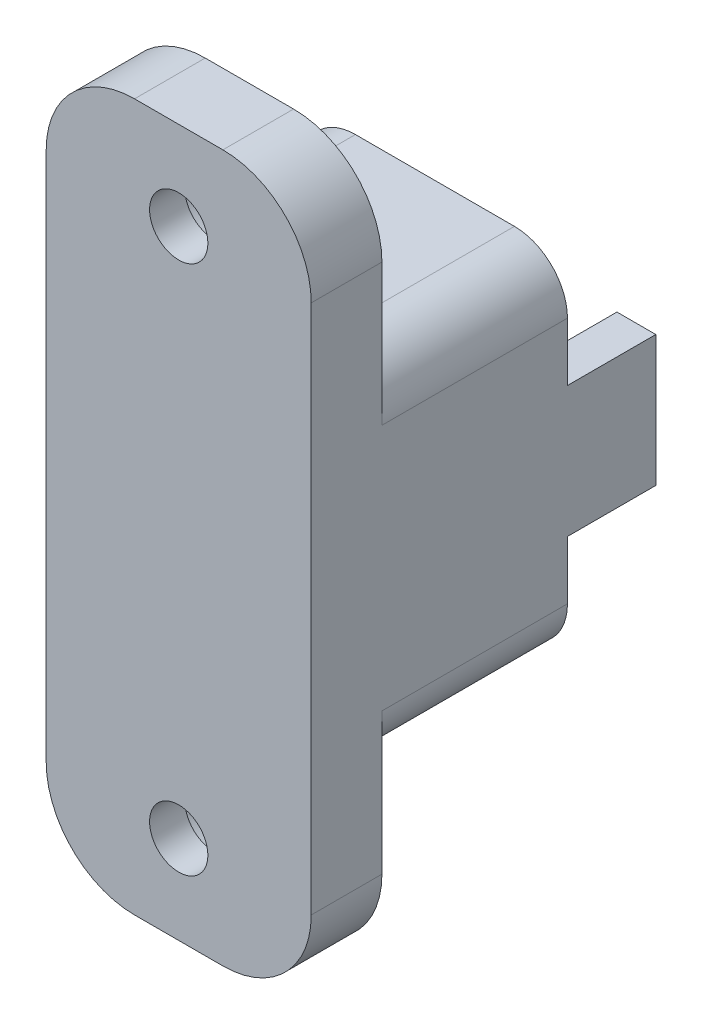
ISO-10303-21;
HEADER;
FILE_DESCRIPTION(('STEP AP214'),'2;1');
FILE_NAME('part.step','',(''),(''),'','','');
FILE_SCHEMA(('AUTOMOTIVE_DESIGN { 1 0 10303 214 1 1 1 1 }'));
ENDSEC;
DATA;
#1=APPLICATION_CONTEXT('core data for automotive mechanical design processes');
#2=APPLICATION_PROTOCOL_DEFINITION('international standard','automotive_design',2000,#1);
#3=PRODUCT_CONTEXT('',#1,'mechanical');
#4=PRODUCT('Part','Part','',(#3));
#5=PRODUCT_RELATED_PRODUCT_CATEGORY('part','',(#4));
#6=PRODUCT_DEFINITION_FORMATION('','',#4);
#7=PRODUCT_DEFINITION_CONTEXT('part definition',#1,'design');
#8=PRODUCT_DEFINITION('design','',#6,#7);
#9=PRODUCT_DEFINITION_SHAPE('','',#8);
#10=(LENGTH_UNIT() NAMED_UNIT(*) SI_UNIT(.MILLI.,.METRE.));
#11=(NAMED_UNIT(*) PLANE_ANGLE_UNIT() SI_UNIT($,.RADIAN.));
#12=(NAMED_UNIT(*) SI_UNIT($,.STERADIAN.) SOLID_ANGLE_UNIT());
#13=UNCERTAINTY_MEASURE_WITH_UNIT(LENGTH_MEASURE(1.E-05),#10,'distance_accuracy_value','');
#14=(GEOMETRIC_REPRESENTATION_CONTEXT(3) GLOBAL_UNCERTAINTY_ASSIGNED_CONTEXT((#13)) GLOBAL_UNIT_ASSIGNED_CONTEXT((#10,
#11,#12)) REPRESENTATION_CONTEXT('',''));
#15=CARTESIAN_POINT('',(0.,0.,0.));
#16=DIRECTION('',(0.,0.,1.));
#17=DIRECTION('',(1.,0.,0.));
#18=AXIS2_PLACEMENT_3D('',#15,#16,#17);
#19=CARTESIAN_POINT('',(-7.5,-1.50786714585182,55.5));
#20=DIRECTION('',(-1.,0.,0.));
#21=DIRECTION('',(0.,0.,1.));
#22=AXIS2_PLACEMENT_3D('',#19,#20,#21);
#23=PLANE('',#22);
#24=DIRECTION('',(0.,-1.,0.));
#25=VECTOR('',#24,1.);
#26=CARTESIAN_POINT('',(-7.5,-1.50786714585182,59.5));
#27=LINE('',#26,#25);
#28=CARTESIAN_POINT('',(-7.5,15.,59.5));
#29=VERTEX_POINT('',#28);
#30=CARTESIAN_POINT('',(-7.5,-15.,59.5));
#31=VERTEX_POINT('',#30);
#32=EDGE_CURVE('E443',#29,#31,#27,.T.);
#33=ORIENTED_EDGE('',*,*,#32,.F.);
#34=DIRECTION('',(0.,0.,1.));
#35=VECTOR('',#34,1.);
#36=CARTESIAN_POINT('',(-7.5,15.,55.5));
#37=LINE('',#36,#35);
#38=CARTESIAN_POINT('',(-7.5,15.,55.5));
#39=VERTEX_POINT('',#38);
#40=EDGE_CURVE('E570',#29,#39,#37,.F.);
#41=ORIENTED_EDGE('',*,*,#40,.T.);
#42=DIRECTION('',(0.,-1.,0.));
#43=VECTOR('',#42,1.);
#44=CARTESIAN_POINT('',(-7.5,-1.50786714585182,55.5));
#45=LINE('',#44,#43);
#46=CARTESIAN_POINT('',(-7.5,7.,55.5));
#47=VERTEX_POINT('',#46);
#48=EDGE_CURVE('E453',#39,#47,#45,.T.);
#49=ORIENTED_EDGE('',*,*,#48,.T.);
#50=DIRECTION('',(0.,0.,1.));
#51=VECTOR('',#50,1.);
#52=CARTESIAN_POINT('',(-7.5,7.,45.));
#53=LINE('',#52,#51);
#54=CARTESIAN_POINT('',(-7.5,7.,45.));
#55=VERTEX_POINT('',#54);
#56=EDGE_CURVE('E493',#47,#55,#53,.F.);
#57=ORIENTED_EDGE('',*,*,#56,.T.);
#58=DIRECTION('',(0.,-1.,0.));
#59=VECTOR('',#58,1.);
#60=CARTESIAN_POINT('',(-7.5,-1.50786714585182,45.));
#61=LINE('',#60,#59);
#62=CARTESIAN_POINT('',(-7.5,3.7,45.));
#63=VERTEX_POINT('',#62);
#64=EDGE_CURVE('E413',#55,#63,#61,.T.);
#65=ORIENTED_EDGE('',*,*,#64,.T.);
#66=DIRECTION('',(0.,0.,1.));
#67=VECTOR('',#66,1.);
#68=CARTESIAN_POINT('',(-7.5,3.7,40.));
#69=LINE('',#68,#67);
#70=CARTESIAN_POINT('',(-7.5,3.7,40.));
#71=VERTEX_POINT('',#70);
#72=EDGE_CURVE('E402',#71,#63,#69,.T.);
#73=ORIENTED_EDGE('',*,*,#72,.F.);
#74=DIRECTION('',(0.,-1.,0.));
#75=VECTOR('',#74,1.);
#76=CARTESIAN_POINT('',(-7.5,-1.50786714585182,40.));
#77=LINE('',#76,#75);
#78=CARTESIAN_POINT('',(-7.5,-3.7,40.));
#79=VERTEX_POINT('',#78);
#80=EDGE_CURVE('E366',#71,#79,#77,.T.);
#81=ORIENTED_EDGE('',*,*,#80,.T.);
#82=DIRECTION('',(0.,0.,1.));
#83=VECTOR('',#82,1.);
#84=CARTESIAN_POINT('',(-7.5,-3.7,40.));
#85=LINE('',#84,#83);
#86=CARTESIAN_POINT('',(-7.5,-3.7,45.));
#87=VERTEX_POINT('',#86);
#88=EDGE_CURVE('E382',#79,#87,#85,.T.);
#89=ORIENTED_EDGE('',*,*,#88,.T.);
#90=CARTESIAN_POINT('',(-7.5,-7.,45.));
#91=VERTEX_POINT('',#90);
#92=EDGE_CURVE('E411',#87,#91,#61,.T.);
#93=ORIENTED_EDGE('',*,*,#92,.T.);
#94=DIRECTION('',(0.,0.,1.));
#95=VECTOR('',#94,1.);
#96=CARTESIAN_POINT('',(-7.5,-7.,55.5));
#97=LINE('',#96,#95);
#98=CARTESIAN_POINT('',(-7.5,-7.,55.5));
#99=VERTEX_POINT('',#98);
#100=EDGE_CURVE('E496',#91,#99,#97,.T.);
#101=ORIENTED_EDGE('',*,*,#100,.T.);
#102=CARTESIAN_POINT('',(-7.5,-15.,55.5));
#103=VERTEX_POINT('',#102);
#104=EDGE_CURVE('E451',#99,#103,#45,.T.);
#105=ORIENTED_EDGE('',*,*,#104,.T.);
#106=DIRECTION('',(0.,0.,1.));
#107=VECTOR('',#106,1.);
#108=CARTESIAN_POINT('',(-7.5,-15.,55.5));
#109=LINE('',#108,#107);
#110=EDGE_CURVE('E566',#103,#31,#109,.T.);
#111=ORIENTED_EDGE('',*,*,#110,.T.);
#112=EDGE_LOOP('',(#33,#41,#49,#57,#65,#73,#81,#89,#93,#101,#105,#111));
#113=FACE_BOUND('',#112,.T.);
#114=DIRECTION('',(0.,0.,-1.));
#115=VECTOR('',#114,1.);
#116=CARTESIAN_POINT('',(-7.5,-2.9,48.3596902340651));
#117=LINE('',#116,#115);
#118=CARTESIAN_POINT('',(-7.5,-2.9,50.));
#119=VERTEX_POINT('',#118);
#120=CARTESIAN_POINT('',(-7.5,-2.9,47.));
#121=VERTEX_POINT('',#120);
#122=EDGE_CURVE('E308',#119,#121,#117,.T.);
#123=ORIENTED_EDGE('',*,*,#122,.T.);
#124=DIRECTION('',(0.,1.,0.));
#125=VECTOR('',#124,1.);
#126=CARTESIAN_POINT('',(-7.5,0.0214725732803344,47.));
#127=LINE('',#126,#125);
#128=CARTESIAN_POINT('',(-7.5,2.9,47.));
#129=VERTEX_POINT('',#128);
#130=EDGE_CURVE('E271',#121,#129,#127,.T.);
#131=ORIENTED_EDGE('',*,*,#130,.T.);
#132=DIRECTION('',(0.,0.,-1.));
#133=VECTOR('',#132,1.);
#134=CARTESIAN_POINT('',(-7.5,2.9,48.1294283518046));
#135=LINE('',#134,#133);
#136=CARTESIAN_POINT('',(-7.5,2.9,50.));
#137=VERTEX_POINT('',#136);
#138=EDGE_CURVE('E293',#137,#129,#135,.T.);
#139=ORIENTED_EDGE('',*,*,#138,.F.);
#140=DIRECTION('',(0.,1.,0.));
#141=VECTOR('',#140,1.);
#142=CARTESIAN_POINT('',(-7.5,0.0214725732803349,50.));
#143=LINE('',#142,#141);
#144=EDGE_CURVE('E39',#119,#137,#143,.T.);
#145=ORIENTED_EDGE('',*,*,#144,.F.);
#146=EDGE_LOOP('',(#123,#131,#139,#145));
#147=FACE_BOUND('',#146,.T.);
#148=ADVANCED_FACE('F16',(#113,#147),#23,.T.);
#149=CARTESIAN_POINT('',(0.,0.,55.));
#150=DIRECTION('',(0.,0.,-1.));
#151=DIRECTION('',(-1.,0.,0.));
#152=AXIS2_PLACEMENT_3D('',#149,#150,#151);
#153=CYLINDRICAL_SURFACE('',#152,1.65);
#154=CARTESIAN_POINT('',(0.,0.,45.));
#155=DIRECTION('',(0.,0.,-1.));
#156=DIRECTION('',(1.,0.,0.));
#157=AXIS2_PLACEMENT_3D('',#154,#155,#156);
#158=CIRCLE('',#157,1.65);
#159=CARTESIAN_POINT('',(1.65000000000001,0.,45.));
#160=VERTEX_POINT('',#159);
#161=EDGE_CURVE('E324',#160,#160,#158,.T.);
#162=ORIENTED_EDGE('',*,*,#161,.T.);
#163=EDGE_LOOP('',(#162));
#164=FACE_BOUND('',#163,.T.);
#165=CARTESIAN_POINT('',(0.,0.,47.));
#166=DIRECTION('',(0.,0.,1.));
#167=DIRECTION('',(0.,-1.,0.));
#168=AXIS2_PLACEMENT_3D('',#165,#166,#167);
#169=CIRCLE('',#168,1.65);
#170=CARTESIAN_POINT('',(0.,-1.64999999999998,47.));
#171=VERTEX_POINT('',#170);
#172=EDGE_CURVE('E20',#171,#171,#169,.F.);
#173=ORIENTED_EDGE('',*,*,#172,.F.);
#174=EDGE_LOOP('',(#173));
#175=FACE_BOUND('',#174,.T.);
#176=ADVANCED_FACE('F606',(#164,#175),#153,.F.);
#177=CARTESIAN_POINT('',(0.,0.,45.));
#178=DIRECTION('',(0.,0.,-1.));
#179=DIRECTION('',(1.,0.,0.));
#180=AXIS2_PLACEMENT_3D('',#177,#178,#179);
#181=PLANE('',#180);
#182=ORIENTED_EDGE('',*,*,#161,.F.);
#183=EDGE_LOOP('',(#182));
#184=FACE_BOUND('',#183,.T.);
#185=DIRECTION('',(1.,0.,0.));
#186=VECTOR('',#185,1.);
#187=CARTESIAN_POINT('',(0.,-10.,45.));
#188=LINE('',#187,#186);
#189=CARTESIAN_POINT('',(-4.5,-10.,45.));
#190=VERTEX_POINT('',#189);
#191=CARTESIAN_POINT('',(4.5,-10.,45.));
#192=VERTEX_POINT('',#191);
#193=EDGE_CURVE('E407',#190,#192,#188,.T.);
#194=ORIENTED_EDGE('',*,*,#193,.F.);
#195=CARTESIAN_POINT('',(-4.5,-7.,45.));
#196=DIRECTION('',(0.,0.,-1.));
#197=DIRECTION('',(-1.,0.,0.));
#198=AXIS2_PLACEMENT_3D('',#195,#196,#197);
#199=CIRCLE('',#198,3.);
#200=EDGE_CURVE('E516',#190,#91,#199,.T.);
#201=ORIENTED_EDGE('',*,*,#200,.T.);
#202=ORIENTED_EDGE('',*,*,#92,.F.);
#203=DIRECTION('',(1.,0.,0.));
#204=VECTOR('',#203,1.);
#205=CARTESIAN_POINT('',(-6.46282042376698,-3.7,45.));
#206=LINE('',#205,#204);
#207=CARTESIAN_POINT('',(-5.3,-3.7,45.));
#208=VERTEX_POINT('',#207);
#209=EDGE_CURVE('E371',#87,#208,#206,.T.);
#210=ORIENTED_EDGE('',*,*,#209,.T.);
#211=DIRECTION('',(0.,1.,0.));
#212=VECTOR('',#211,1.);
#213=CARTESIAN_POINT('',(-5.3,0.262452171929203,45.));
#214=LINE('',#213,#212);
#215=CARTESIAN_POINT('',(-5.3,3.7,45.));
#216=VERTEX_POINT('',#215);
#217=EDGE_CURVE('E386',#208,#216,#214,.T.);
#218=ORIENTED_EDGE('',*,*,#217,.T.);
#219=DIRECTION('',(1.,0.,0.));
#220=VECTOR('',#219,1.);
#221=CARTESIAN_POINT('',(-6.46282042376698,3.7,45.));
#222=LINE('',#221,#220);
#223=EDGE_CURVE('E357',#63,#216,#222,.T.);
#224=ORIENTED_EDGE('',*,*,#223,.F.);
#225=ORIENTED_EDGE('',*,*,#64,.F.);
#226=CARTESIAN_POINT('',(-4.5,7.,45.));
#227=DIRECTION('',(0.,0.,-1.));
#228=DIRECTION('',(-1.,0.,0.));
#229=AXIS2_PLACEMENT_3D('',#226,#227,#228);
#230=CIRCLE('',#229,3.);
#231=CARTESIAN_POINT('',(-4.5,10.,45.));
#232=VERTEX_POINT('',#231);
#233=EDGE_CURVE('E513',#55,#232,#230,.T.);
#234=ORIENTED_EDGE('',*,*,#233,.T.);
#235=DIRECTION('',(1.,0.,0.));
#236=VECTOR('',#235,1.);
#237=CARTESIAN_POINT('',(0.,10.,45.));
#238=LINE('',#237,#236);
#239=CARTESIAN_POINT('',(4.5,10.,45.));
#240=VERTEX_POINT('',#239);
#241=EDGE_CURVE('E416',#232,#240,#238,.T.);
#242=ORIENTED_EDGE('',*,*,#241,.T.);
#243=CARTESIAN_POINT('',(4.5,7.,45.));
#244=DIRECTION('',(0.,0.,-1.));
#245=DIRECTION('',(-1.,0.,0.));
#246=AXIS2_PLACEMENT_3D('',#243,#244,#245);
#247=CIRCLE('',#246,3.);
#248=CARTESIAN_POINT('',(7.5,7.,45.));
#249=VERTEX_POINT('',#248);
#250=EDGE_CURVE('E510',#240,#249,#247,.T.);
#251=ORIENTED_EDGE('',*,*,#250,.T.);
#252=DIRECTION('',(0.,-1.,0.));
#253=VECTOR('',#252,1.);
#254=CARTESIAN_POINT('',(7.5,-1.50786714585182,45.));
#255=LINE('',#254,#253);
#256=CARTESIAN_POINT('',(7.5,3.7,45.));
#257=VERTEX_POINT('',#256);
#258=EDGE_CURVE('E421',#249,#257,#255,.T.);
#259=ORIENTED_EDGE('',*,*,#258,.T.);
#260=DIRECTION('',(-1.,0.,0.));
#261=VECTOR('',#260,1.);
#262=CARTESIAN_POINT('',(6.32231473661957,3.7,45.));
#263=LINE('',#262,#261);
#264=CARTESIAN_POINT('',(5.3,3.7,45.));
#265=VERTEX_POINT('',#264);
#266=EDGE_CURVE('E332',#257,#265,#263,.T.);
#267=ORIENTED_EDGE('',*,*,#266,.T.);
#268=DIRECTION('',(0.,1.,0.));
#269=VECTOR('',#268,1.);
#270=CARTESIAN_POINT('',(5.3,-0.0304838176816702,45.));
#271=LINE('',#270,#269);
#272=CARTESIAN_POINT('',(5.3,-3.7,45.));
#273=VERTEX_POINT('',#272);
#274=EDGE_CURVE('E323',#273,#265,#271,.T.);
#275=ORIENTED_EDGE('',*,*,#274,.F.);
#276=DIRECTION('',(-1.,0.,0.));
#277=VECTOR('',#276,1.);
#278=CARTESIAN_POINT('',(6.32231473661956,-3.7,45.));
#279=LINE('',#278,#277);
#280=CARTESIAN_POINT('',(7.5,-3.7,45.));
#281=VERTEX_POINT('',#280);
#282=EDGE_CURVE('E346',#281,#273,#279,.T.);
#283=ORIENTED_EDGE('',*,*,#282,.F.);
#284=CARTESIAN_POINT('',(7.5,-7.,45.));
#285=VERTEX_POINT('',#284);
#286=EDGE_CURVE('E420',#281,#285,#255,.T.);
#287=ORIENTED_EDGE('',*,*,#286,.T.);
#288=CARTESIAN_POINT('',(4.5,-7.,45.));
#289=DIRECTION('',(0.,0.,-1.));
#290=DIRECTION('',(-1.,0.,0.));
#291=AXIS2_PLACEMENT_3D('',#288,#289,#290);
#292=CIRCLE('',#291,3.);
#293=EDGE_CURVE('E507',#285,#192,#292,.T.);
#294=ORIENTED_EDGE('',*,*,#293,.T.);
#295=EDGE_LOOP('',(#194,#201,#202,#210,#218,#224,#225,#234,#242,#251,#259,#267,#275,#283,#287,#294));
#296=FACE_BOUND('',#295,.T.);
#297=ADVANCED_FACE('F608',(#184,#296),#181,.T.);
#298=CARTESIAN_POINT('',(0.,0.,55.5));
#299=DIRECTION('',(0.,0.,-1.));
#300=DIRECTION('',(1.,0.,0.));
#301=AXIS2_PLACEMENT_3D('',#298,#299,#300);
#302=PLANE('',#301);
#303=CARTESIAN_POINT('',(0.,-15.,55.5));
#304=DIRECTION('',(0.,0.,-1.));
#305=DIRECTION('',(1.,0.,0.));
#306=AXIS2_PLACEMENT_3D('',#303,#304,#305);
#307=CIRCLE('',#306,3.);
#308=CARTESIAN_POINT('',(2.99999999999998,-15.,55.5));
#309=VERTEX_POINT('',#308);
#310=EDGE_CURVE('E464',#309,#309,#307,.T.);
#311=ORIENTED_EDGE('',*,*,#310,.F.);
#312=EDGE_LOOP('',(#311));
#313=FACE_BOUND('',#312,.T.);
#314=DIRECTION('',(0.,-1.,0.));
#315=VECTOR('',#314,1.);
#316=CARTESIAN_POINT('',(7.5,-1.50786714585182,55.5));
#317=LINE('',#316,#315);
#318=CARTESIAN_POINT('',(7.5,-7.,55.5));
#319=VERTEX_POINT('',#318);
#320=CARTESIAN_POINT('',(7.5,-15.,55.5));
#321=VERTEX_POINT('',#320);
#322=EDGE_CURVE('E460',#319,#321,#317,.T.);
#323=ORIENTED_EDGE('',*,*,#322,.T.);
#324=CARTESIAN_POINT('',(2.5,-15.,55.5));
#325=DIRECTION('',(0.,0.,-1.));
#326=DIRECTION('',(-1.,0.,0.));
#327=AXIS2_PLACEMENT_3D('',#324,#325,#326);
#328=CIRCLE('',#327,5.);
#329=CARTESIAN_POINT('',(2.5,-20.,55.5));
#330=VERTEX_POINT('',#329);
#331=EDGE_CURVE('E10',#321,#330,#328,.T.);
#332=ORIENTED_EDGE('',*,*,#331,.T.);
#333=DIRECTION('',(1.,0.,0.));
#334=VECTOR('',#333,1.);
#335=CARTESIAN_POINT('',(0.,-20.,55.5));
#336=LINE('',#335,#334);
#337=CARTESIAN_POINT('',(-2.5,-20.,55.5));
#338=VERTEX_POINT('',#337);
#339=EDGE_CURVE('E468',#338,#330,#336,.T.);
#340=ORIENTED_EDGE('',*,*,#339,.F.);
#341=CARTESIAN_POINT('',(-2.5,-15.,55.5));
#342=DIRECTION('',(0.,0.,-1.));
#343=DIRECTION('',(-1.,0.,0.));
#344=AXIS2_PLACEMENT_3D('',#341,#342,#343);
#345=CIRCLE('',#344,5.);
#346=EDGE_CURVE('E26',#338,#103,#345,.T.);
#347=ORIENTED_EDGE('',*,*,#346,.T.);
#348=ORIENTED_EDGE('',*,*,#104,.F.);
#349=CARTESIAN_POINT('',(-4.5,-7.,55.5));
#350=DIRECTION('',(0.,0.,-1.));
#351=DIRECTION('',(-1.,0.,0.));
#352=AXIS2_PLACEMENT_3D('',#349,#350,#351);
#353=CIRCLE('',#352,3.);
#354=CARTESIAN_POINT('',(-4.5,-10.,55.5));
#355=VERTEX_POINT('',#354);
#356=EDGE_CURVE('E533',#99,#355,#353,.F.);
#357=ORIENTED_EDGE('',*,*,#356,.T.);
#358=DIRECTION('',(1.,0.,0.));
#359=VECTOR('',#358,1.);
#360=CARTESIAN_POINT('',(0.,-10.,55.5));
#361=LINE('',#360,#359);
#362=CARTESIAN_POINT('',(4.5,-10.,55.5));
#363=VERTEX_POINT('',#362);
#364=EDGE_CURVE('E406',#355,#363,#361,.T.);
#365=ORIENTED_EDGE('',*,*,#364,.T.);
#366=CARTESIAN_POINT('',(4.5,-7.,55.5));
#367=DIRECTION('',(0.,0.,-1.));
#368=DIRECTION('',(-1.,0.,0.));
#369=AXIS2_PLACEMENT_3D('',#366,#367,#368);
#370=CIRCLE('',#369,3.);
#371=EDGE_CURVE('E543',#363,#319,#370,.F.);
#372=ORIENTED_EDGE('',*,*,#371,.T.);
#373=EDGE_LOOP('',(#323,#332,#340,#347,#348,#357,#365,#372));
#374=FACE_BOUND('',#373,.T.);
#375=ADVANCED_FACE('F616',(#313,#374),#302,.T.);
#376=CARTESIAN_POINT('',(7.5,-1.50786714585182,55.5));
#377=DIRECTION('',(-1.,0.,0.));
#378=DIRECTION('',(0.,0.,1.));
#379=AXIS2_PLACEMENT_3D('',#376,#377,#378);
#380=PLANE('',#379);
#381=CARTESIAN_POINT('',(7.5,15.,55.5));
#382=VERTEX_POINT('',#381);
#383=CARTESIAN_POINT('',(7.5,7.,55.5));
#384=VERTEX_POINT('',#383);
#385=EDGE_CURVE('E461',#382,#384,#317,.T.);
#386=ORIENTED_EDGE('',*,*,#385,.F.);
#387=DIRECTION('',(0.,0.,1.));
#388=VECTOR('',#387,1.);
#389=CARTESIAN_POINT('',(7.5,15.,55.5));
#390=LINE('',#389,#388);
#391=CARTESIAN_POINT('',(7.5,15.,59.5));
#392=VERTEX_POINT('',#391);
#393=EDGE_CURVE('E582',#382,#392,#390,.T.);
#394=ORIENTED_EDGE('',*,*,#393,.T.);
#395=DIRECTION('',(0.,-1.,0.));
#396=VECTOR('',#395,1.);
#397=CARTESIAN_POINT('',(7.5,-1.50786714585182,59.5));
#398=LINE('',#397,#396);
#399=CARTESIAN_POINT('',(7.5,-15.,59.5));
#400=VERTEX_POINT('',#399);
#401=EDGE_CURVE('E479',#392,#400,#398,.T.);
#402=ORIENTED_EDGE('',*,*,#401,.T.);
#403=DIRECTION('',(0.,0.,1.));
#404=VECTOR('',#403,1.);
#405=CARTESIAN_POINT('',(7.5,-15.,55.5));
#406=LINE('',#405,#404);
#407=EDGE_CURVE('E579',#400,#321,#406,.F.);
#408=ORIENTED_EDGE('',*,*,#407,.T.);
#409=ORIENTED_EDGE('',*,*,#322,.F.);
#410=DIRECTION('',(0.,0.,1.));
#411=VECTOR('',#410,1.);
#412=CARTESIAN_POINT('',(7.5,-7.,45.));
#413=LINE('',#412,#411);
#414=EDGE_CURVE('E526',#319,#285,#413,.F.);
#415=ORIENTED_EDGE('',*,*,#414,.T.);
#416=ORIENTED_EDGE('',*,*,#286,.F.);
#417=DIRECTION('',(0.,0.,1.));
#418=VECTOR('',#417,1.);
#419=CARTESIAN_POINT('',(7.5,-3.7,40.));
#420=LINE('',#419,#418);
#421=CARTESIAN_POINT('',(7.5,-3.7,40.));
#422=VERTEX_POINT('',#421);
#423=EDGE_CURVE('E358',#422,#281,#420,.T.);
#424=ORIENTED_EDGE('',*,*,#423,.F.);
#425=DIRECTION('',(0.,-1.,0.));
#426=VECTOR('',#425,1.);
#427=CARTESIAN_POINT('',(7.5,-1.50786714585182,40.));
#428=LINE('',#427,#426);
#429=CARTESIAN_POINT('',(7.5,3.7,40.));
#430=VERTEX_POINT('',#429);
#431=EDGE_CURVE('E335',#430,#422,#428,.T.);
#432=ORIENTED_EDGE('',*,*,#431,.F.);
#433=DIRECTION('',(0.,0.,1.));
#434=VECTOR('',#433,1.);
#435=CARTESIAN_POINT('',(7.5,3.7,40.));
#436=LINE('',#435,#434);
#437=EDGE_CURVE('E353',#430,#257,#436,.T.);
#438=ORIENTED_EDGE('',*,*,#437,.T.);
#439=ORIENTED_EDGE('',*,*,#258,.F.);
#440=DIRECTION('',(0.,0.,1.));
#441=VECTOR('',#440,1.);
#442=CARTESIAN_POINT('',(7.5,7.,55.5));
#443=LINE('',#442,#441);
#444=EDGE_CURVE('E529',#249,#384,#443,.T.);
#445=ORIENTED_EDGE('',*,*,#444,.T.);
#446=EDGE_LOOP('',(#386,#394,#402,#408,#409,#415,#416,#424,#432,#438,#439,#445));
#447=FACE_BOUND('',#446,.T.);
#448=ADVANCED_FACE('F861',(#447),#380,.F.);
#449=CARTESIAN_POINT('',(0.,-20.,55.5));
#450=DIRECTION('',(0.,-1.,0.));
#451=DIRECTION('',(0.,0.,-1.));
#452=AXIS2_PLACEMENT_3D('',#449,#450,#451);
#453=PLANE('',#452);
#454=ORIENTED_EDGE('',*,*,#339,.T.);
#455=DIRECTION('',(0.,0.,1.));
#456=VECTOR('',#455,1.);
#457=CARTESIAN_POINT('',(2.5,-20.,59.5));
#458=LINE('',#457,#456);
#459=CARTESIAN_POINT('',(2.5,-20.,59.5));
#460=VERTEX_POINT('',#459);
#461=EDGE_CURVE('E589',#330,#460,#458,.T.);
#462=ORIENTED_EDGE('',*,*,#461,.T.);
#463=DIRECTION('',(1.,0.,0.));
#464=VECTOR('',#463,1.);
#465=CARTESIAN_POINT('',(0.,-20.,59.5));
#466=LINE('',#465,#464);
#467=CARTESIAN_POINT('',(-2.5,-20.,59.5));
#468=VERTEX_POINT('',#467);
#469=EDGE_CURVE('E452',#468,#460,#466,.T.);
#470=ORIENTED_EDGE('',*,*,#469,.F.);
#471=DIRECTION('',(0.,0.,1.));
#472=VECTOR('',#471,1.);
#473=CARTESIAN_POINT('',(-2.5,-20.,55.5));
#474=LINE('',#473,#472);
#475=EDGE_CURVE('E586',#468,#338,#474,.F.);
#476=ORIENTED_EDGE('',*,*,#475,.T.);
#477=EDGE_LOOP('',(#454,#462,#470,#476));
#478=FACE_BOUND('',#477,.T.);
#479=ADVANCED_FACE('F855',(#478),#453,.T.);
#480=CARTESIAN_POINT('',(0.,20.,55.5));
#481=DIRECTION('',(0.,-1.,0.));
#482=DIRECTION('',(0.,0.,-1.));
#483=AXIS2_PLACEMENT_3D('',#480,#481,#482);
#484=PLANE('',#483);
#485=DIRECTION('',(1.,0.,0.));
#486=VECTOR('',#485,1.);
#487=CARTESIAN_POINT('',(0.,20.,55.5));
#488=LINE('',#487,#486);
#489=CARTESIAN_POINT('',(-2.5,20.,55.5));
#490=VERTEX_POINT('',#489);
#491=CARTESIAN_POINT('',(2.5,20.,55.5));
#492=VERTEX_POINT('',#491);
#493=EDGE_CURVE('E456',#490,#492,#488,.T.);
#494=ORIENTED_EDGE('',*,*,#493,.F.);
#495=DIRECTION('',(0.,0.,1.));
#496=VECTOR('',#495,1.);
#497=CARTESIAN_POINT('',(-2.5,20.,59.5));
#498=LINE('',#497,#496);
#499=CARTESIAN_POINT('',(-2.5,20.,59.5));
#500=VERTEX_POINT('',#499);
#501=EDGE_CURVE('E550',#490,#500,#498,.T.);
#502=ORIENTED_EDGE('',*,*,#501,.T.);
#503=DIRECTION('',(1.,0.,0.));
#504=VECTOR('',#503,1.);
#505=CARTESIAN_POINT('',(0.,20.,59.5));
#506=LINE('',#505,#504);
#507=CARTESIAN_POINT('',(2.5,20.,59.5));
#508=VERTEX_POINT('',#507);
#509=EDGE_CURVE('E475',#500,#508,#506,.T.);
#510=ORIENTED_EDGE('',*,*,#509,.T.);
#511=DIRECTION('',(0.,0.,1.));
#512=VECTOR('',#511,1.);
#513=CARTESIAN_POINT('',(2.5,20.,55.5));
#514=LINE('',#513,#512);
#515=EDGE_CURVE('E547',#508,#492,#514,.F.);
#516=ORIENTED_EDGE('',*,*,#515,.T.);
#517=EDGE_LOOP('',(#494,#502,#510,#516));
#518=FACE_BOUND('',#517,.T.);
#519=ADVANCED_FACE('F849',(#518),#484,.F.);
#520=CARTESIAN_POINT('',(0.,15.,55.5));
#521=DIRECTION('',(0.,0.,1.));
#522=DIRECTION('',(1.,0.,0.));
#523=AXIS2_PLACEMENT_3D('',#520,#521,#522);
#524=CYLINDRICAL_SURFACE('',#523,3.);
#525=CARTESIAN_POINT('',(0.,15.,57.5));
#526=DIRECTION('',(0.,0.,-1.));
#527=DIRECTION('',(-1.,0.,0.));
#528=AXIS2_PLACEMENT_3D('',#525,#526,#527);
#529=CIRCLE('',#528,3.);
#530=CARTESIAN_POINT('',(-3.00000000000002,15.,57.5));
#531=VERTEX_POINT('',#530);
#532=EDGE_CURVE('E471',#531,#531,#529,.T.);
#533=ORIENTED_EDGE('',*,*,#532,.F.);
#534=EDGE_LOOP('',(#533));
#535=FACE_BOUND('',#534,.T.);
#536=CARTESIAN_POINT('',(0.,15.,55.5));
#537=DIRECTION('',(0.,0.,-1.));
#538=DIRECTION('',(1.,0.,0.));
#539=AXIS2_PLACEMENT_3D('',#536,#537,#538);
#540=CIRCLE('',#539,3.);
#541=CARTESIAN_POINT('',(2.99999999999998,15.,55.5));
#542=VERTEX_POINT('',#541);
#543=EDGE_CURVE('E447',#542,#542,#540,.T.);
#544=ORIENTED_EDGE('',*,*,#543,.T.);
#545=EDGE_LOOP('',(#544));
#546=FACE_BOUND('',#545,.T.);
#547=ADVANCED_FACE('F842',(#535,#546),#524,.F.);
#548=CARTESIAN_POINT('',(0.,-15.,55.5));
#549=DIRECTION('',(0.,0.,1.));
#550=DIRECTION('',(1.,0.,0.));
#551=AXIS2_PLACEMENT_3D('',#548,#549,#550);
#552=CYLINDRICAL_SURFACE('',#551,3.);
#553=CARTESIAN_POINT('',(0.,-15.,57.5));
#554=DIRECTION('',(0.,0.,-1.));
#555=DIRECTION('',(-1.,0.,0.));
#556=AXIS2_PLACEMENT_3D('',#553,#554,#555);
#557=CIRCLE('',#556,3.);
#558=CARTESIAN_POINT('',(-3.00000000000002,-15.,57.5));
#559=VERTEX_POINT('',#558);
#560=EDGE_CURVE('E489',#559,#559,#557,.T.);
#561=ORIENTED_EDGE('',*,*,#560,.F.);
#562=EDGE_LOOP('',(#561));
#563=FACE_BOUND('',#562,.T.);
#564=ORIENTED_EDGE('',*,*,#310,.T.);
#565=EDGE_LOOP('',(#564));
#566=FACE_BOUND('',#565,.T.);
#567=ADVANCED_FACE('F834',(#563,#566),#552,.F.);
#568=ORIENTED_EDGE('',*,*,#48,.F.);
#569=CARTESIAN_POINT('',(-2.5,15.,55.5));
#570=DIRECTION('',(0.,0.,-1.));
#571=DIRECTION('',(-1.,0.,0.));
#572=AXIS2_PLACEMENT_3D('',#569,#570,#571);
#573=CIRCLE('',#572,5.);
#574=EDGE_CURVE('E576',#39,#490,#573,.T.);
#575=ORIENTED_EDGE('',*,*,#574,.T.);
#576=ORIENTED_EDGE('',*,*,#493,.T.);
#577=CARTESIAN_POINT('',(2.5,15.,55.5));
#578=DIRECTION('',(0.,0.,-1.));
#579=DIRECTION('',(-1.,0.,0.));
#580=AXIS2_PLACEMENT_3D('',#577,#578,#579);
#581=CIRCLE('',#580,5.);
#582=EDGE_CURVE('E573',#492,#382,#581,.T.);
#583=ORIENTED_EDGE('',*,*,#582,.T.);
#584=ORIENTED_EDGE('',*,*,#385,.T.);
#585=CARTESIAN_POINT('',(4.5,7.,55.5));
#586=DIRECTION('',(0.,0.,-1.));
#587=DIRECTION('',(-1.,0.,0.));
#588=AXIS2_PLACEMENT_3D('',#585,#586,#587);
#589=CIRCLE('',#588,3.);
#590=CARTESIAN_POINT('',(4.5,10.,55.5));
#591=VERTEX_POINT('',#590);
#592=EDGE_CURVE('E540',#384,#591,#589,.F.);
#593=ORIENTED_EDGE('',*,*,#592,.T.);
#594=DIRECTION('',(1.,0.,0.));
#595=VECTOR('',#594,1.);
#596=CARTESIAN_POINT('',(0.,10.,55.5));
#597=LINE('',#596,#595);
#598=CARTESIAN_POINT('',(-4.5,10.,55.5));
#599=VERTEX_POINT('',#598);
#600=EDGE_CURVE('E412',#599,#591,#597,.T.);
#601=ORIENTED_EDGE('',*,*,#600,.F.);
#602=CARTESIAN_POINT('',(-4.5,7.,55.5));
#603=DIRECTION('',(0.,0.,-1.));
#604=DIRECTION('',(-1.,0.,0.));
#605=AXIS2_PLACEMENT_3D('',#602,#603,#604);
#606=CIRCLE('',#605,3.);
#607=EDGE_CURVE('E536',#599,#47,#606,.F.);
#608=ORIENTED_EDGE('',*,*,#607,.T.);
#609=EDGE_LOOP('',(#568,#575,#576,#583,#584,#593,#601,#608));
#610=FACE_BOUND('',#609,.T.);
#611=ORIENTED_EDGE('',*,*,#543,.F.);
#612=EDGE_LOOP('',(#611));
#613=FACE_BOUND('',#612,.T.);
#614=ADVANCED_FACE('F826',(#610,#613),#302,.T.);
#615=CARTESIAN_POINT('',(0.,0.,59.5));
#616=DIRECTION('',(0.,0.,-1.));
#617=DIRECTION('',(1.,0.,0.));
#618=AXIS2_PLACEMENT_3D('',#615,#616,#617);
#619=PLANE('',#618);
#620=ORIENTED_EDGE('',*,*,#509,.F.);
#621=CARTESIAN_POINT('',(-2.5,15.,59.5));
#622=DIRECTION('',(0.,0.,-1.));
#623=DIRECTION('',(-1.,0.,0.));
#624=AXIS2_PLACEMENT_3D('',#621,#622,#623);
#625=CIRCLE('',#624,5.);
#626=EDGE_CURVE('E563',#500,#29,#625,.F.);
#627=ORIENTED_EDGE('',*,*,#626,.T.);
#628=ORIENTED_EDGE('',*,*,#32,.T.);
#629=CARTESIAN_POINT('',(-2.5,-15.,59.5));
#630=DIRECTION('',(0.,0.,-1.));
#631=DIRECTION('',(-1.,0.,0.));
#632=AXIS2_PLACEMENT_3D('',#629,#630,#631);
#633=CIRCLE('',#632,5.);
#634=EDGE_CURVE('E554',#31,#468,#633,.F.);
#635=ORIENTED_EDGE('',*,*,#634,.T.);
#636=ORIENTED_EDGE('',*,*,#469,.T.);
#637=CARTESIAN_POINT('',(2.5,-15.,59.5));
#638=DIRECTION('',(0.,0.,-1.));
#639=DIRECTION('',(-1.,0.,0.));
#640=AXIS2_PLACEMENT_3D('',#637,#638,#639);
#641=CIRCLE('',#640,5.);
#642=EDGE_CURVE('E557',#460,#400,#641,.F.);
#643=ORIENTED_EDGE('',*,*,#642,.T.);
#644=ORIENTED_EDGE('',*,*,#401,.F.);
#645=CARTESIAN_POINT('',(2.5,15.,59.5));
#646=DIRECTION('',(0.,0.,-1.));
#647=DIRECTION('',(-1.,0.,0.));
#648=AXIS2_PLACEMENT_3D('',#645,#646,#647);
#649=CIRCLE('',#648,5.);
#650=EDGE_CURVE('E560',#392,#508,#649,.F.);
#651=ORIENTED_EDGE('',*,*,#650,.T.);
#652=EDGE_LOOP('',(#620,#627,#628,#635,#636,#643,#644,#651));
#653=FACE_BOUND('',#652,.T.);
#654=CARTESIAN_POINT('',(0.,15.,59.5));
#655=DIRECTION('',(0.,0.,-1.));
#656=DIRECTION('',(1.,0.,0.));
#657=AXIS2_PLACEMENT_3D('',#654,#655,#656);
#658=CIRCLE('',#657,1.65);
#659=CARTESIAN_POINT('',(1.64999999999998,15.,59.5));
#660=VERTEX_POINT('',#659);
#661=EDGE_CURVE('E435',#660,#660,#658,.T.);
#662=ORIENTED_EDGE('',*,*,#661,.T.);
#663=EDGE_LOOP('',(#662));
#664=FACE_BOUND('',#663,.T.);
#665=CARTESIAN_POINT('',(0.,-15.,59.5));
#666=DIRECTION('',(0.,0.,-1.));
#667=DIRECTION('',(1.,0.,0.));
#668=AXIS2_PLACEMENT_3D('',#665,#666,#667);
#669=CIRCLE('',#668,1.65);
#670=CARTESIAN_POINT('',(1.64999999999998,-15.,59.5));
#671=VERTEX_POINT('',#670);
#672=EDGE_CURVE('E424',#671,#671,#669,.T.);
#673=ORIENTED_EDGE('',*,*,#672,.T.);
#674=EDGE_LOOP('',(#673));
#675=FACE_BOUND('',#674,.T.);
#676=ADVANCED_FACE('F819',(#653,#664,#675),#619,.F.);
#677=CARTESIAN_POINT('',(0.,15.,57.5));
#678=DIRECTION('',(0.,0.,1.));
#679=DIRECTION('',(1.,0.,0.));
#680=AXIS2_PLACEMENT_3D('',#677,#678,#679);
#681=CYLINDRICAL_SURFACE('',#680,1.65);
#682=CARTESIAN_POINT('',(0.,15.,57.5));
#683=DIRECTION('',(0.,0.,-1.));
#684=DIRECTION('',(1.,0.,0.));
#685=AXIS2_PLACEMENT_3D('',#682,#683,#684);
#686=CIRCLE('',#685,1.65);
#687=CARTESIAN_POINT('',(1.64999999999998,15.,57.5));
#688=VERTEX_POINT('',#687);
#689=EDGE_CURVE('E439',#688,#688,#686,.T.);
#690=ORIENTED_EDGE('',*,*,#689,.T.);
#691=EDGE_LOOP('',(#690));
#692=FACE_BOUND('',#691,.T.);
#693=ORIENTED_EDGE('',*,*,#661,.F.);
#694=EDGE_LOOP('',(#693));
#695=FACE_BOUND('',#694,.T.);
#696=ADVANCED_FACE('F812',(#692,#695),#681,.F.);
#697=CARTESIAN_POINT('',(0.,0.,57.5));
#698=DIRECTION('',(0.,0.,-1.));
#699=DIRECTION('',(1.,0.,0.));
#700=AXIS2_PLACEMENT_3D('',#697,#698,#699);
#701=PLANE('',#700);
#702=ORIENTED_EDGE('',*,*,#689,.F.);
#703=EDGE_LOOP('',(#702));
#704=FACE_BOUND('',#703,.T.);
#705=ORIENTED_EDGE('',*,*,#532,.T.);
#706=EDGE_LOOP('',(#705));
#707=FACE_BOUND('',#706,.T.);
#708=ADVANCED_FACE('F805',(#704,#707),#701,.T.);
#709=CARTESIAN_POINT('',(0.,-15.,57.5));
#710=DIRECTION('',(0.,0.,1.));
#711=DIRECTION('',(1.,0.,0.));
#712=AXIS2_PLACEMENT_3D('',#709,#710,#711);
#713=CYLINDRICAL_SURFACE('',#712,1.65);
#714=CARTESIAN_POINT('',(0.,-15.,57.5));
#715=DIRECTION('',(0.,0.,-1.));
#716=DIRECTION('',(1.,0.,0.));
#717=AXIS2_PLACEMENT_3D('',#714,#715,#716);
#718=CIRCLE('',#717,1.65);
#719=CARTESIAN_POINT('',(1.64999999999998,-15.,57.5));
#720=VERTEX_POINT('',#719);
#721=EDGE_CURVE('E431',#720,#720,#718,.T.);
#722=ORIENTED_EDGE('',*,*,#721,.T.);
#723=EDGE_LOOP('',(#722));
#724=FACE_BOUND('',#723,.T.);
#725=ORIENTED_EDGE('',*,*,#672,.F.);
#726=EDGE_LOOP('',(#725));
#727=FACE_BOUND('',#726,.T.);
#728=ADVANCED_FACE('F798',(#724,#727),#713,.F.);
#729=CARTESIAN_POINT('',(0.,0.,57.5));
#730=DIRECTION('',(0.,0.,-1.));
#731=DIRECTION('',(1.,0.,0.));
#732=AXIS2_PLACEMENT_3D('',#729,#730,#731);
#733=PLANE('',#732);
#734=ORIENTED_EDGE('',*,*,#721,.F.);
#735=EDGE_LOOP('',(#734));
#736=FACE_BOUND('',#735,.T.);
#737=ORIENTED_EDGE('',*,*,#560,.T.);
#738=EDGE_LOOP('',(#737));
#739=FACE_BOUND('',#738,.T.);
#740=ADVANCED_FACE('F791',(#736,#739),#733,.T.);
#741=CARTESIAN_POINT('',(0.,-10.,45.));
#742=DIRECTION('',(0.,-1.,0.));
#743=DIRECTION('',(0.,0.,-1.));
#744=AXIS2_PLACEMENT_3D('',#741,#742,#743);
#745=PLANE('',#744);
#746=ORIENTED_EDGE('',*,*,#364,.F.);
#747=DIRECTION('',(0.,0.,1.));
#748=VECTOR('',#747,1.);
#749=CARTESIAN_POINT('',(-4.5,-10.,45.));
#750=LINE('',#749,#748);
#751=EDGE_CURVE('E504',#355,#190,#750,.F.);
#752=ORIENTED_EDGE('',*,*,#751,.T.);
#753=ORIENTED_EDGE('',*,*,#193,.T.);
#754=DIRECTION('',(0.,0.,1.));
#755=VECTOR('',#754,1.);
#756=CARTESIAN_POINT('',(4.5,-10.,55.5));
#757=LINE('',#756,#755);
#758=EDGE_CURVE('E500',#192,#363,#757,.T.);
#759=ORIENTED_EDGE('',*,*,#758,.T.);
#760=EDGE_LOOP('',(#746,#752,#753,#759));
#761=FACE_BOUND('',#760,.T.);
#762=ADVANCED_FACE('F784',(#761),#745,.T.);
#763=CARTESIAN_POINT('',(0.,10.,45.));
#764=DIRECTION('',(0.,-1.,0.));
#765=DIRECTION('',(0.,0.,-1.));
#766=AXIS2_PLACEMENT_3D('',#763,#764,#765);
#767=PLANE('',#766);
#768=ORIENTED_EDGE('',*,*,#241,.F.);
#769=DIRECTION('',(0.,0.,1.));
#770=VECTOR('',#769,1.);
#771=CARTESIAN_POINT('',(-4.5,10.,55.5));
#772=LINE('',#771,#770);
#773=EDGE_CURVE('E522',#232,#599,#772,.T.);
#774=ORIENTED_EDGE('',*,*,#773,.T.);
#775=ORIENTED_EDGE('',*,*,#600,.T.);
#776=DIRECTION('',(0.,0.,1.));
#777=VECTOR('',#776,1.);
#778=CARTESIAN_POINT('',(4.5,10.,45.));
#779=LINE('',#778,#777);
#780=EDGE_CURVE('E519',#591,#240,#779,.F.);
#781=ORIENTED_EDGE('',*,*,#780,.T.);
#782=EDGE_LOOP('',(#768,#774,#775,#781));
#783=FACE_BOUND('',#782,.T.);
#784=ADVANCED_FACE('F778',(#783),#767,.F.);
#785=CARTESIAN_POINT('',(-6.46282042376698,3.7,40.));
#786=DIRECTION('',(0.,-1.,0.));
#787=DIRECTION('',(0.,0.,-1.));
#788=AXIS2_PLACEMENT_3D('',#785,#786,#787);
#789=PLANE('',#788);
#790=ORIENTED_EDGE('',*,*,#223,.T.);
#791=DIRECTION('',(0.,0.,1.));
#792=VECTOR('',#791,1.);
#793=CARTESIAN_POINT('',(-5.3,3.7,40.));
#794=LINE('',#793,#792);
#795=CARTESIAN_POINT('',(-5.3,3.7,40.));
#796=VERTEX_POINT('',#795);
#797=EDGE_CURVE('E398',#796,#216,#794,.T.);
#798=ORIENTED_EDGE('',*,*,#797,.F.);
#799=DIRECTION('',(1.,0.,0.));
#800=VECTOR('',#799,1.);
#801=CARTESIAN_POINT('',(-6.46282042376698,3.7,40.));
#802=LINE('',#801,#800);
#803=EDGE_CURVE('E370',#71,#796,#802,.T.);
#804=ORIENTED_EDGE('',*,*,#803,.F.);
#805=ORIENTED_EDGE('',*,*,#72,.T.);
#806=EDGE_LOOP('',(#790,#798,#804,#805));
#807=FACE_BOUND('',#806,.T.);
#808=ADVANCED_FACE('F771',(#807),#789,.F.);
#809=CARTESIAN_POINT('',(-5.3,0.262452171929203,40.));
#810=DIRECTION('',(1.,0.,0.));
#811=DIRECTION('',(0.,1.,0.));
#812=AXIS2_PLACEMENT_3D('',#809,#810,#811);
#813=PLANE('',#812);
#814=ORIENTED_EDGE('',*,*,#217,.F.);
#815=DIRECTION('',(0.,0.,1.));
#816=VECTOR('',#815,1.);
#817=CARTESIAN_POINT('',(-5.3,-3.7,40.));
#818=LINE('',#817,#816);
#819=CARTESIAN_POINT('',(-5.3,-3.7,40.));
#820=VERTEX_POINT('',#819);
#821=EDGE_CURVE('E394',#820,#208,#818,.T.);
#822=ORIENTED_EDGE('',*,*,#821,.F.);
#823=DIRECTION('',(0.,1.,0.));
#824=VECTOR('',#823,1.);
#825=CARTESIAN_POINT('',(-5.3,0.262452171929203,40.));
#826=LINE('',#825,#824);
#827=EDGE_CURVE('E374',#820,#796,#826,.T.);
#828=ORIENTED_EDGE('',*,*,#827,.T.);
#829=ORIENTED_EDGE('',*,*,#797,.T.);
#830=EDGE_LOOP('',(#814,#822,#828,#829));
#831=FACE_BOUND('',#830,.T.);
#832=ADVANCED_FACE('F764',(#831),#813,.T.);
#833=CARTESIAN_POINT('',(-6.46282042376698,-3.7,40.));
#834=DIRECTION('',(0.,-1.,0.));
#835=DIRECTION('',(0.,0.,-1.));
#836=AXIS2_PLACEMENT_3D('',#833,#834,#835);
#837=PLANE('',#836);
#838=ORIENTED_EDGE('',*,*,#209,.F.);
#839=ORIENTED_EDGE('',*,*,#88,.F.);
#840=DIRECTION('',(1.,0.,0.));
#841=VECTOR('',#840,1.);
#842=CARTESIAN_POINT('',(-6.46282042376698,-3.7,40.));
#843=LINE('',#842,#841);
#844=EDGE_CURVE('E378',#79,#820,#843,.T.);
#845=ORIENTED_EDGE('',*,*,#844,.T.);
#846=ORIENTED_EDGE('',*,*,#821,.T.);
#847=EDGE_LOOP('',(#838,#839,#845,#846));
#848=FACE_BOUND('',#847,.T.);
#849=ADVANCED_FACE('F757',(#848),#837,.T.);
#850=CARTESIAN_POINT('',(0.,0.,40.));
#851=DIRECTION('',(0.,0.,-1.));
#852=DIRECTION('',(1.,0.,0.));
#853=AXIS2_PLACEMENT_3D('',#850,#851,#852);
#854=PLANE('',#853);
#855=ORIENTED_EDGE('',*,*,#80,.F.);
#856=ORIENTED_EDGE('',*,*,#803,.T.);
#857=ORIENTED_EDGE('',*,*,#827,.F.);
#858=ORIENTED_EDGE('',*,*,#844,.F.);
#859=EDGE_LOOP('',(#855,#856,#857,#858));
#860=FACE_BOUND('',#859,.T.);
#861=ADVANCED_FACE('F750',(#860),#854,.T.);
#862=CARTESIAN_POINT('',(6.32231473661957,3.7,40.));
#863=DIRECTION('',(0.,1.,0.));
#864=DIRECTION('',(-1.,0.,0.));
#865=AXIS2_PLACEMENT_3D('',#862,#863,#864);
#866=PLANE('',#865);
#867=ORIENTED_EDGE('',*,*,#266,.F.);
#868=ORIENTED_EDGE('',*,*,#437,.F.);
#869=DIRECTION('',(-1.,0.,0.));
#870=VECTOR('',#869,1.);
#871=CARTESIAN_POINT('',(6.32231473661957,3.7,40.));
#872=LINE('',#871,#870);
#873=CARTESIAN_POINT('',(5.3,3.7,40.));
#874=VERTEX_POINT('',#873);
#875=EDGE_CURVE('E338',#430,#874,#872,.T.);
#876=ORIENTED_EDGE('',*,*,#875,.T.);
#877=DIRECTION('',(0.,0.,1.));
#878=VECTOR('',#877,1.);
#879=CARTESIAN_POINT('',(5.3,3.7,40.));
#880=LINE('',#879,#878);
#881=EDGE_CURVE('E342',#874,#265,#880,.T.);
#882=ORIENTED_EDGE('',*,*,#881,.T.);
#883=EDGE_LOOP('',(#867,#868,#876,#882));
#884=FACE_BOUND('',#883,.T.);
#885=ADVANCED_FACE('F743',(#884),#866,.T.);
#886=CARTESIAN_POINT('',(6.32231473661956,-3.7,40.));
#887=DIRECTION('',(0.,1.,0.));
#888=DIRECTION('',(-1.,0.,0.));
#889=AXIS2_PLACEMENT_3D('',#886,#887,#888);
#890=PLANE('',#889);
#891=ORIENTED_EDGE('',*,*,#282,.T.);
#892=DIRECTION('',(0.,0.,1.));
#893=VECTOR('',#892,1.);
#894=CARTESIAN_POINT('',(5.3,-3.7,40.));
#895=LINE('',#894,#893);
#896=CARTESIAN_POINT('',(5.3,-3.7,40.));
#897=VERTEX_POINT('',#896);
#898=EDGE_CURVE('E361',#897,#273,#895,.T.);
#899=ORIENTED_EDGE('',*,*,#898,.F.);
#900=DIRECTION('',(-1.,0.,0.));
#901=VECTOR('',#900,1.);
#902=CARTESIAN_POINT('',(6.32231473661956,-3.7,40.));
#903=LINE('',#902,#901);
#904=EDGE_CURVE('E331',#422,#897,#903,.T.);
#905=ORIENTED_EDGE('',*,*,#904,.F.);
#906=ORIENTED_EDGE('',*,*,#423,.T.);
#907=EDGE_LOOP('',(#891,#899,#905,#906));
#908=FACE_BOUND('',#907,.T.);
#909=ADVANCED_FACE('F736',(#908),#890,.F.);
#910=CARTESIAN_POINT('',(5.3,-0.0304838176816702,40.));
#911=DIRECTION('',(1.,0.,0.));
#912=DIRECTION('',(0.,1.,0.));
#913=AXIS2_PLACEMENT_3D('',#910,#911,#912);
#914=PLANE('',#913);
#915=ORIENTED_EDGE('',*,*,#274,.T.);
#916=ORIENTED_EDGE('',*,*,#881,.F.);
#917=DIRECTION('',(0.,1.,0.));
#918=VECTOR('',#917,1.);
#919=CARTESIAN_POINT('',(5.3,-0.0304838176816702,40.));
#920=LINE('',#919,#918);
#921=EDGE_CURVE('E328',#897,#874,#920,.T.);
#922=ORIENTED_EDGE('',*,*,#921,.F.);
#923=ORIENTED_EDGE('',*,*,#898,.T.);
#924=EDGE_LOOP('',(#915,#916,#922,#923));
#925=FACE_BOUND('',#924,.T.);
#926=ADVANCED_FACE('F729',(#925),#914,.F.);
#927=CARTESIAN_POINT('',(0.,0.,40.));
#928=DIRECTION('',(0.,0.,-1.));
#929=DIRECTION('',(1.,0.,0.));
#930=AXIS2_PLACEMENT_3D('',#927,#928,#929);
#931=PLANE('',#930);
#932=ORIENTED_EDGE('',*,*,#875,.F.);
#933=ORIENTED_EDGE('',*,*,#431,.T.);
#934=ORIENTED_EDGE('',*,*,#904,.T.);
#935=ORIENTED_EDGE('',*,*,#921,.T.);
#936=EDGE_LOOP('',(#932,#933,#934,#935));
#937=FACE_BOUND('',#936,.T.);
#938=ADVANCED_FACE('F722',(#937),#931,.T.);
#939=CARTESIAN_POINT('',(-4.5,-7.,55.5));
#940=DIRECTION('',(0.,0.,1.));
#941=DIRECTION('',(1.,0.,0.));
#942=AXIS2_PLACEMENT_3D('',#939,#940,#941);
#943=CYLINDRICAL_SURFACE('',#942,3.);
#944=ORIENTED_EDGE('',*,*,#200,.F.);
#945=ORIENTED_EDGE('',*,*,#751,.F.);
#946=ORIENTED_EDGE('',*,*,#356,.F.);
#947=ORIENTED_EDGE('',*,*,#100,.F.);
#948=EDGE_LOOP('',(#944,#945,#946,#947));
#949=FACE_BOUND('',#948,.T.);
#950=ADVANCED_FACE('F715',(#949),#943,.T.);
#951=CARTESIAN_POINT('',(-4.5,7.,45.));
#952=DIRECTION('',(0.,0.,-1.));
#953=DIRECTION('',(-1.,0.,0.));
#954=AXIS2_PLACEMENT_3D('',#951,#952,#953);
#955=CYLINDRICAL_SURFACE('',#954,3.);
#956=ORIENTED_EDGE('',*,*,#233,.F.);
#957=ORIENTED_EDGE('',*,*,#56,.F.);
#958=ORIENTED_EDGE('',*,*,#607,.F.);
#959=ORIENTED_EDGE('',*,*,#773,.F.);
#960=EDGE_LOOP('',(#956,#957,#958,#959));
#961=FACE_BOUND('',#960,.T.);
#962=ADVANCED_FACE('F708',(#961),#955,.T.);
#963=CARTESIAN_POINT('',(4.5,7.,55.5));
#964=DIRECTION('',(0.,0.,1.));
#965=DIRECTION('',(1.,0.,0.));
#966=AXIS2_PLACEMENT_3D('',#963,#964,#965);
#967=CYLINDRICAL_SURFACE('',#966,3.);
#968=ORIENTED_EDGE('',*,*,#250,.F.);
#969=ORIENTED_EDGE('',*,*,#780,.F.);
#970=ORIENTED_EDGE('',*,*,#592,.F.);
#971=ORIENTED_EDGE('',*,*,#444,.F.);
#972=EDGE_LOOP('',(#968,#969,#970,#971));
#973=FACE_BOUND('',#972,.T.);
#974=ADVANCED_FACE('F699',(#973),#967,.T.);
#975=CARTESIAN_POINT('',(4.5,-7.,45.));
#976=DIRECTION('',(0.,0.,-1.));
#977=DIRECTION('',(-1.,0.,0.));
#978=AXIS2_PLACEMENT_3D('',#975,#976,#977);
#979=CYLINDRICAL_SURFACE('',#978,3.);
#980=ORIENTED_EDGE('',*,*,#293,.F.);
#981=ORIENTED_EDGE('',*,*,#414,.F.);
#982=ORIENTED_EDGE('',*,*,#371,.F.);
#983=ORIENTED_EDGE('',*,*,#758,.F.);
#984=EDGE_LOOP('',(#980,#981,#982,#983));
#985=FACE_BOUND('',#984,.T.);
#986=ADVANCED_FACE('F691',(#985),#979,.T.);
#987=CARTESIAN_POINT('',(-2.5,15.,55.5));
#988=DIRECTION('',(0.,0.,-1.));
#989=DIRECTION('',(-1.,0.,0.));
#990=AXIS2_PLACEMENT_3D('',#987,#988,#989);
#991=CYLINDRICAL_SURFACE('',#990,5.);
#992=ORIENTED_EDGE('',*,*,#574,.F.);
#993=ORIENTED_EDGE('',*,*,#40,.F.);
#994=ORIENTED_EDGE('',*,*,#626,.F.);
#995=ORIENTED_EDGE('',*,*,#501,.F.);
#996=EDGE_LOOP('',(#992,#993,#994,#995));
#997=FACE_BOUND('',#996,.T.);
#998=ADVANCED_FACE('F684',(#997),#991,.T.);
#999=CARTESIAN_POINT('',(2.5,15.,55.5));
#1000=DIRECTION('',(0.,0.,1.));
#1001=DIRECTION('',(1.,0.,0.));
#1002=AXIS2_PLACEMENT_3D('',#999,#1000,#1001);
#1003=CYLINDRICAL_SURFACE('',#1002,5.);
#1004=ORIENTED_EDGE('',*,*,#582,.F.);
#1005=ORIENTED_EDGE('',*,*,#515,.F.);
#1006=ORIENTED_EDGE('',*,*,#650,.F.);
#1007=ORIENTED_EDGE('',*,*,#393,.F.);
#1008=EDGE_LOOP('',(#1004,#1005,#1006,#1007));
#1009=FACE_BOUND('',#1008,.T.);
#1010=ADVANCED_FACE('F678',(#1009),#1003,.T.);
#1011=CARTESIAN_POINT('',(2.5,-15.,55.5));
#1012=DIRECTION('',(0.,0.,-1.));
#1013=DIRECTION('',(-1.,0.,0.));
#1014=AXIS2_PLACEMENT_3D('',#1011,#1012,#1013);
#1015=CYLINDRICAL_SURFACE('',#1014,5.);
#1016=ORIENTED_EDGE('',*,*,#331,.F.);
#1017=ORIENTED_EDGE('',*,*,#407,.F.);
#1018=ORIENTED_EDGE('',*,*,#642,.F.);
#1019=ORIENTED_EDGE('',*,*,#461,.F.);
#1020=EDGE_LOOP('',(#1016,#1017,#1018,#1019));
#1021=FACE_BOUND('',#1020,.T.);
#1022=ADVANCED_FACE('F671',(#1021),#1015,.T.);
#1023=CARTESIAN_POINT('',(-2.5,-15.,55.5));
#1024=DIRECTION('',(0.,0.,1.));
#1025=DIRECTION('',(1.,0.,0.));
#1026=AXIS2_PLACEMENT_3D('',#1023,#1024,#1025);
#1027=CYLINDRICAL_SURFACE('',#1026,5.);
#1028=ORIENTED_EDGE('',*,*,#346,.F.);
#1029=ORIENTED_EDGE('',*,*,#475,.F.);
#1030=ORIENTED_EDGE('',*,*,#634,.F.);
#1031=ORIENTED_EDGE('',*,*,#110,.F.);
#1032=EDGE_LOOP('',(#1028,#1029,#1030,#1031));
#1033=FACE_BOUND('',#1032,.T.);
#1034=ADVANCED_FACE('F18',(#1033),#1027,.T.);
#1035=CARTESIAN_POINT('',(4.,0.0214725732803344,47.));
#1036=DIRECTION('',(0.,0.,1.));
#1037=DIRECTION('',(0.,-1.,0.));
#1038=AXIS2_PLACEMENT_3D('',#1035,#1036,#1037);
#1039=PLANE('',#1038);
#1040=ORIENTED_EDGE('',*,*,#130,.F.);
#1041=DIRECTION('',(-1.,0.,0.));
#1042=VECTOR('',#1041,1.);
#1043=CARTESIAN_POINT('',(4.,-2.9,47.));
#1044=LINE('',#1043,#1042);
#1045=CARTESIAN_POINT('',(4.,-2.9,47.));
#1046=VERTEX_POINT('',#1045);
#1047=EDGE_CURVE('E264',#1046,#121,#1044,.T.);
#1048=ORIENTED_EDGE('',*,*,#1047,.F.);
#1049=DIRECTION('',(0.,1.,0.));
#1050=VECTOR('',#1049,1.);
#1051=CARTESIAN_POINT('',(4.,0.0214725732803344,47.));
#1052=LINE('',#1051,#1050);
#1053=CARTESIAN_POINT('',(4.,2.9,47.));
#1054=VERTEX_POINT('',#1053);
#1055=EDGE_CURVE('E269',#1046,#1054,#1052,.T.);
#1056=ORIENTED_EDGE('',*,*,#1055,.T.);
#1057=DIRECTION('',(-1.,0.,0.));
#1058=VECTOR('',#1057,1.);
#1059=CARTESIAN_POINT('',(4.,2.9,47.));
#1060=LINE('',#1059,#1058);
#1061=EDGE_CURVE('E306',#1054,#129,#1060,.T.);
#1062=ORIENTED_EDGE('',*,*,#1061,.T.);
#1063=EDGE_LOOP('',(#1040,#1048,#1056,#1062));
#1064=FACE_BOUND('',#1063,.T.);
#1065=ORIENTED_EDGE('',*,*,#172,.T.);
#1066=EDGE_LOOP('',(#1065));
#1067=FACE_BOUND('',#1066,.T.);
#1068=ADVANCED_FACE('F266',(#1064,#1067),#1039,.T.);
#1069=CARTESIAN_POINT('',(4.,0.0214725732803349,50.));
#1070=DIRECTION('',(0.,0.,1.));
#1071=DIRECTION('',(0.,-1.,0.));
#1072=AXIS2_PLACEMENT_3D('',#1069,#1070,#1071);
#1073=PLANE('',#1072);
#1074=ORIENTED_EDGE('',*,*,#144,.T.);
#1075=DIRECTION('',(-1.,0.,0.));
#1076=VECTOR('',#1075,1.);
#1077=CARTESIAN_POINT('',(4.,2.9,50.));
#1078=LINE('',#1077,#1076);
#1079=CARTESIAN_POINT('',(4.,2.9,50.));
#1080=VERTEX_POINT('',#1079);
#1081=EDGE_CURVE('E314',#1080,#137,#1078,.T.);
#1082=ORIENTED_EDGE('',*,*,#1081,.F.);
#1083=DIRECTION('',(0.,1.,0.));
#1084=VECTOR('',#1083,1.);
#1085=CARTESIAN_POINT('',(4.,0.0214725732803349,50.));
#1086=LINE('',#1085,#1084);
#1087=CARTESIAN_POINT('',(4.,-2.9,50.));
#1088=VERTEX_POINT('',#1087);
#1089=EDGE_CURVE('E286',#1088,#1080,#1086,.T.);
#1090=ORIENTED_EDGE('',*,*,#1089,.F.);
#1091=DIRECTION('',(-1.,0.,0.));
#1092=VECTOR('',#1091,1.);
#1093=CARTESIAN_POINT('',(4.,-2.9,50.));
#1094=LINE('',#1093,#1092);
#1095=EDGE_CURVE('E277',#1088,#119,#1094,.T.);
#1096=ORIENTED_EDGE('',*,*,#1095,.T.);
#1097=EDGE_LOOP('',(#1074,#1082,#1090,#1096));
#1098=FACE_BOUND('',#1097,.T.);
#1099=CARTESIAN_POINT('',(0.,0.,50.));
#1100=DIRECTION('',(0.,0.,1.));
#1101=DIRECTION('',(0.,-1.,0.));
#1102=AXIS2_PLACEMENT_3D('',#1099,#1100,#1101);
#1103=CIRCLE('',#1102,1.65);
#1104=CARTESIAN_POINT('',(0.,-1.64999999999998,50.));
#1105=VERTEX_POINT('',#1104);
#1106=EDGE_CURVE('E276',#1105,#1105,#1103,.F.);
#1107=ORIENTED_EDGE('',*,*,#1106,.F.);
#1108=EDGE_LOOP('',(#1107));
#1109=FACE_BOUND('',#1108,.T.);
#1110=ADVANCED_FACE('F639',(#1098,#1109),#1073,.F.);
#1111=CARTESIAN_POINT('',(4.,-2.9,48.3596902340651));
#1112=DIRECTION('',(0.,1.,0.));
#1113=DIRECTION('',(0.,0.,1.));
#1114=AXIS2_PLACEMENT_3D('',#1111,#1112,#1113);
#1115=PLANE('',#1114);
#1116=ORIENTED_EDGE('',*,*,#122,.F.);
#1117=ORIENTED_EDGE('',*,*,#1095,.F.);
#1118=DIRECTION('',(0.,0.,-1.));
#1119=VECTOR('',#1118,1.);
#1120=CARTESIAN_POINT('',(4.,-2.9,48.3596902340651));
#1121=LINE('',#1120,#1119);
#1122=EDGE_CURVE('E280',#1088,#1046,#1121,.T.);
#1123=ORIENTED_EDGE('',*,*,#1122,.T.);
#1124=ORIENTED_EDGE('',*,*,#1047,.T.);
#1125=EDGE_LOOP('',(#1116,#1117,#1123,#1124));
#1126=FACE_BOUND('',#1125,.T.);
#1127=ADVANCED_FACE('F281',(#1126),#1115,.T.);
#1128=CARTESIAN_POINT('',(4.,2.9,48.1294283518046));
#1129=DIRECTION('',(0.,1.,0.));
#1130=DIRECTION('',(0.,0.,1.));
#1131=AXIS2_PLACEMENT_3D('',#1128,#1129,#1130);
#1132=PLANE('',#1131);
#1133=ORIENTED_EDGE('',*,*,#138,.T.);
#1134=ORIENTED_EDGE('',*,*,#1061,.F.);
#1135=DIRECTION('',(0.,0.,-1.));
#1136=VECTOR('',#1135,1.);
#1137=CARTESIAN_POINT('',(4.,2.9,48.1294283518046));
#1138=LINE('',#1137,#1136);
#1139=EDGE_CURVE('E291',#1080,#1054,#1138,.T.);
#1140=ORIENTED_EDGE('',*,*,#1139,.F.);
#1141=ORIENTED_EDGE('',*,*,#1081,.T.);
#1142=EDGE_LOOP('',(#1133,#1134,#1140,#1141));
#1143=FACE_BOUND('',#1142,.T.);
#1144=ADVANCED_FACE('F634',(#1143),#1132,.F.);
#1145=CARTESIAN_POINT('',(4.,0.,49.75));
#1146=DIRECTION('',(-1.,0.,0.));
#1147=DIRECTION('',(0.,-1.,0.));
#1148=AXIS2_PLACEMENT_3D('',#1145,#1146,#1147);
#1149=PLANE('',#1148);
#1150=ORIENTED_EDGE('',*,*,#1055,.F.);
#1151=ORIENTED_EDGE('',*,*,#1122,.F.);
#1152=ORIENTED_EDGE('',*,*,#1089,.T.);
#1153=ORIENTED_EDGE('',*,*,#1139,.T.);
#1154=EDGE_LOOP('',(#1150,#1151,#1152,#1153));
#1155=FACE_BOUND('',#1154,.T.);
#1156=ADVANCED_FACE('F289',(#1155),#1149,.T.);
#1157=CARTESIAN_POINT('',(0.,0.,55.));
#1158=DIRECTION('',(0.,0.,-1.));
#1159=DIRECTION('',(1.,0.,0.));
#1160=AXIS2_PLACEMENT_3D('',#1157,#1158,#1159);
#1161=PLANE('',#1160);
#1162=CARTESIAN_POINT('',(0.,0.,55.));
#1163=DIRECTION('',(0.,0.,-1.));
#1164=DIRECTION('',(1.,0.,0.));
#1165=AXIS2_PLACEMENT_3D('',#1162,#1163,#1164);
#1166=CIRCLE('',#1165,1.65);
#1167=CARTESIAN_POINT('',(1.65000000000001,0.,55.));
#1168=VERTEX_POINT('',#1167);
#1169=EDGE_CURVE('E319',#1168,#1168,#1166,.T.);
#1170=ORIENTED_EDGE('',*,*,#1169,.T.);
#1171=EDGE_LOOP('',(#1170));
#1172=FACE_BOUND('',#1171,.T.);
#1173=ADVANCED_FACE('F624',(#1172),#1161,.T.);
#1174=ORIENTED_EDGE('',*,*,#1106,.T.);
#1175=EDGE_LOOP('',(#1174));
#1176=FACE_BOUND('',#1175,.T.);
#1177=ORIENTED_EDGE('',*,*,#1169,.F.);
#1178=EDGE_LOOP('',(#1177));
#1179=FACE_BOUND('',#1178,.T.);
#1180=ADVANCED_FACE('F611',(#1176,#1179),#153,.F.);
#1181=CLOSED_SHELL('',(#148,#176,#297,#375,#448,#479,#519,#547,#567,#614,#676,#696,#708,#728,
#740,#762,#784,#808,#832,#849,#861,#885,#909,#926,#938,#950,#962,#974,#986,#998,#1010,#1022,
#1034,#1068,#1110,#1127,#1144,#1156,#1173,#1180));
#1182=MANIFOLD_SOLID_BREP('B1',#1181);
#1183=ADVANCED_BREP_SHAPE_REPRESENTATION('',(#18,#1182),#14);
#1184=SHAPE_DEFINITION_REPRESENTATION(#9,#1183);
ENDSEC;
END-ISO-10303-21;
